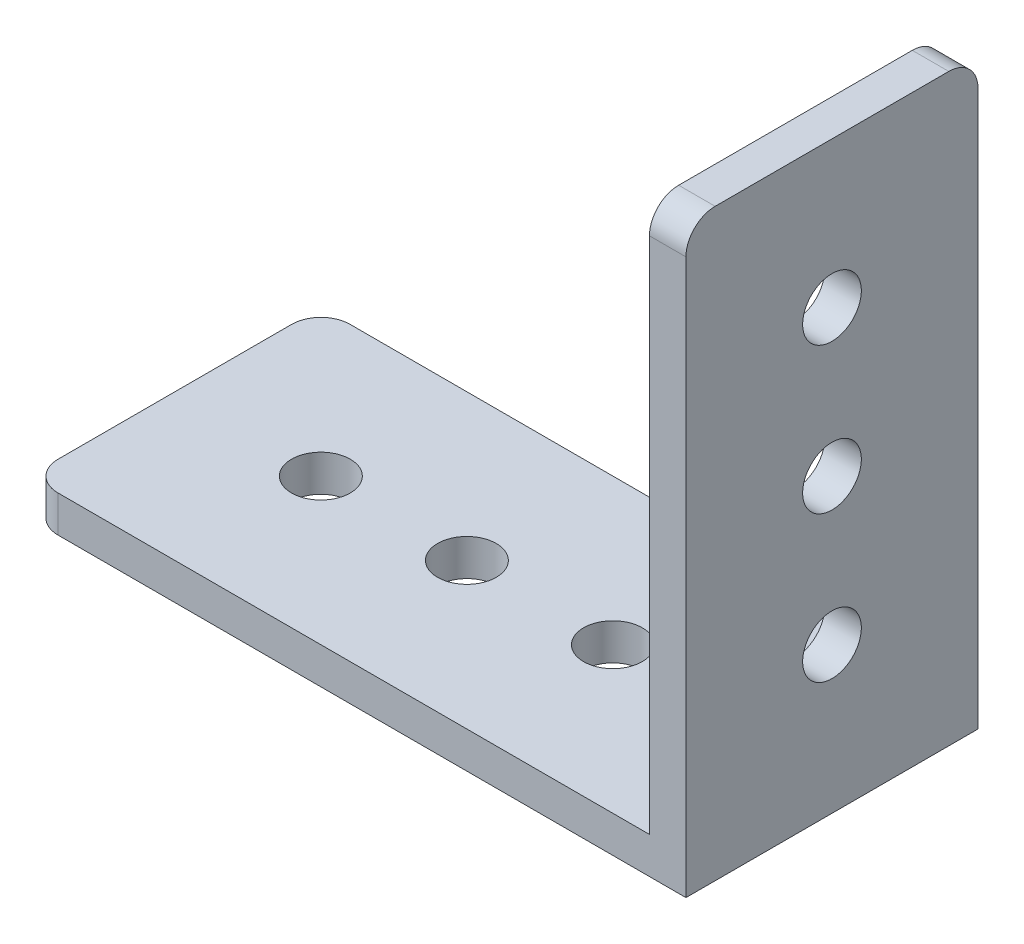
ISO-10303-21;
HEADER;
FILE_DESCRIPTION(('STEP AP214'),'2;1');
FILE_NAME('part.step','',(''),(''),'','','');
FILE_SCHEMA(('AUTOMOTIVE_DESIGN { 1 0 10303 214 1 1 1 1 }'));
ENDSEC;
DATA;
#1=APPLICATION_CONTEXT('core data for automotive mechanical design processes');
#2=APPLICATION_PROTOCOL_DEFINITION('international standard','automotive_design',2000,#1);
#3=PRODUCT_CONTEXT('',#1,'mechanical');
#4=PRODUCT('Part','Part','',(#3));
#5=PRODUCT_RELATED_PRODUCT_CATEGORY('part','',(#4));
#6=PRODUCT_DEFINITION_FORMATION('','',#4);
#7=PRODUCT_DEFINITION_CONTEXT('part definition',#1,'design');
#8=PRODUCT_DEFINITION('design','',#6,#7);
#9=PRODUCT_DEFINITION_SHAPE('','',#8);
#10=(LENGTH_UNIT() NAMED_UNIT(*) SI_UNIT(.MILLI.,.METRE.));
#11=(NAMED_UNIT(*) PLANE_ANGLE_UNIT() SI_UNIT($,.RADIAN.));
#12=(NAMED_UNIT(*) SI_UNIT($,.STERADIAN.) SOLID_ANGLE_UNIT());
#13=UNCERTAINTY_MEASURE_WITH_UNIT(LENGTH_MEASURE(1.E-05),#10,'distance_accuracy_value','');
#14=(GEOMETRIC_REPRESENTATION_CONTEXT(3) GLOBAL_UNCERTAINTY_ASSIGNED_CONTEXT((#13)) GLOBAL_UNIT_ASSIGNED_CONTEXT((#10,
#11,#12)) REPRESENTATION_CONTEXT('',''));
#15=CARTESIAN_POINT('',(0.,0.,0.));
#16=DIRECTION('',(0.,0.,1.));
#17=DIRECTION('',(1.,0.,0.));
#18=AXIS2_PLACEMENT_3D('',#15,#16,#17);
#19=CARTESIAN_POINT('',(-57.15,0.,25.4));
#20=DIRECTION('',(0.,1.,0.));
#21=DIRECTION('',(0.,0.,1.));
#22=AXIS2_PLACEMENT_3D('',#19,#20,#21);
#23=PLANE('',#22);
#24=CARTESIAN_POINT('',(-31.75,0.,12.7));
#25=DIRECTION('',(0.,1.,0.));
#26=DIRECTION('',(0.,0.,1.));
#27=AXIS2_PLACEMENT_3D('',#24,#25,#26);
#28=CIRCLE('',#27,2.55269999999999);
#29=CARTESIAN_POINT('',(-31.75,0.,15.2527));
#30=VERTEX_POINT('',#29);
#31=EDGE_CURVE('E284',#30,#30,#28,.F.);
#32=ORIENTED_EDGE('',*,*,#31,.F.);
#33=EDGE_LOOP('',(#32));
#34=FACE_BOUND('',#33,.T.);
#35=DIRECTION('',(0.,0.,-1.));
#36=VECTOR('',#35,1.);
#37=CARTESIAN_POINT('',(-57.15,0.,25.4));
#38=LINE('',#37,#36);
#39=CARTESIAN_POINT('',(-57.15,0.,22.86));
#40=VERTEX_POINT('',#39);
#41=CARTESIAN_POINT('',(-57.15,0.,2.54));
#42=VERTEX_POINT('',#41);
#43=EDGE_CURVE('E192',#40,#42,#38,.T.);
#44=ORIENTED_EDGE('',*,*,#43,.T.);
#45=CARTESIAN_POINT('',(-54.61,0.,2.54));
#46=DIRECTION('',(0.,1.,0.));
#47=DIRECTION('',(0.,0.,1.));
#48=AXIS2_PLACEMENT_3D('',#45,#46,#47);
#49=CIRCLE('',#48,2.54);
#50=CARTESIAN_POINT('',(-54.61,0.,0.));
#51=VERTEX_POINT('',#50);
#52=EDGE_CURVE('E148',#42,#51,#49,.F.);
#53=ORIENTED_EDGE('',*,*,#52,.T.);
#54=DIRECTION('',(1.,0.,0.));
#55=VECTOR('',#54,1.);
#56=CARTESIAN_POINT('',(-57.15,0.,0.));
#57=LINE('',#56,#55);
#58=CARTESIAN_POINT('',(0.,0.,0.));
#59=VERTEX_POINT('',#58);
#60=EDGE_CURVE('E133',#51,#59,#57,.T.);
#61=ORIENTED_EDGE('',*,*,#60,.T.);
#62=DIRECTION('',(0.,0.,-1.));
#63=VECTOR('',#62,1.);
#64=CARTESIAN_POINT('',(0.,0.,25.4));
#65=LINE('',#64,#63);
#66=CARTESIAN_POINT('',(0.,0.,25.4));
#67=VERTEX_POINT('',#66);
#68=EDGE_CURVE('E126',#67,#59,#65,.T.);
#69=ORIENTED_EDGE('',*,*,#68,.F.);
#70=DIRECTION('',(1.,0.,0.));
#71=VECTOR('',#70,1.);
#72=CARTESIAN_POINT('',(-57.15,0.,25.4));
#73=LINE('',#72,#71);
#74=CARTESIAN_POINT('',(-54.61,0.,25.4));
#75=VERTEX_POINT('',#74);
#76=EDGE_CURVE('E111',#75,#67,#73,.T.);
#77=ORIENTED_EDGE('',*,*,#76,.F.);
#78=CARTESIAN_POINT('',(-54.61,0.,22.86));
#79=DIRECTION('',(0.,1.,0.));
#80=DIRECTION('',(0.,0.,1.));
#81=AXIS2_PLACEMENT_3D('',#78,#79,#80);
#82=CIRCLE('',#81,2.54);
#83=EDGE_CURVE('E146',#75,#40,#82,.F.);
#84=ORIENTED_EDGE('',*,*,#83,.T.);
#85=EDGE_LOOP('',(#44,#53,#61,#69,#77,#84));
#86=FACE_BOUND('',#85,.T.);
#87=CARTESIAN_POINT('',(-44.45,0.,12.7));
#88=DIRECTION('',(0.,1.,0.));
#89=DIRECTION('',(0.,0.,1.));
#90=AXIS2_PLACEMENT_3D('',#87,#88,#89);
#91=CIRCLE('',#90,2.55269999999999);
#92=CARTESIAN_POINT('',(-44.45,0.,15.2527));
#93=VERTEX_POINT('',#92);
#94=EDGE_CURVE('E290',#93,#93,#91,.F.);
#95=ORIENTED_EDGE('',*,*,#94,.F.);
#96=EDGE_LOOP('',(#95));
#97=FACE_BOUND('',#96,.T.);
#98=CARTESIAN_POINT('',(-19.05,0.,12.7));
#99=DIRECTION('',(0.,1.,0.));
#100=DIRECTION('',(0.,0.,1.));
#101=AXIS2_PLACEMENT_3D('',#98,#99,#100);
#102=CIRCLE('',#101,2.55269999999999);
#103=CARTESIAN_POINT('',(-19.05,0.,15.2527));
#104=VERTEX_POINT('',#103);
#105=EDGE_CURVE('E276',#104,#104,#102,.F.);
#106=ORIENTED_EDGE('',*,*,#105,.F.);
#107=EDGE_LOOP('',(#106));
#108=FACE_BOUND('',#107,.T.);
#109=ADVANCED_FACE('F33',(#34,#86,#97,#108),#23,.F.);
#110=CARTESIAN_POINT('',(0.,0.,25.4));
#111=DIRECTION('',(-1.,0.,0.));
#112=DIRECTION('',(0.,0.,1.));
#113=AXIS2_PLACEMENT_3D('',#110,#111,#112);
#114=PLANE('',#113);
#115=CARTESIAN_POINT('',(0.,38.1,12.7));
#116=DIRECTION('',(-1.,0.,0.));
#117=DIRECTION('',(0.,0.,1.));
#118=AXIS2_PLACEMENT_3D('',#115,#116,#117);
#119=CIRCLE('',#118,2.55269999999999);
#120=CARTESIAN_POINT('',(0.,38.1,15.2527));
#121=VERTEX_POINT('',#120);
#122=EDGE_CURVE('E296',#121,#121,#119,.F.);
#123=ORIENTED_EDGE('',*,*,#122,.F.);
#124=EDGE_LOOP('',(#123));
#125=FACE_BOUND('',#124,.T.);
#126=CARTESIAN_POINT('',(0.,25.4,12.7));
#127=DIRECTION('',(-1.,0.,0.));
#128=DIRECTION('',(0.,0.,1.));
#129=AXIS2_PLACEMENT_3D('',#126,#127,#128);
#130=CIRCLE('',#129,2.55269999999999);
#131=CARTESIAN_POINT('',(0.,25.4,15.2527));
#132=VERTEX_POINT('',#131);
#133=EDGE_CURVE('E302',#132,#132,#130,.F.);
#134=ORIENTED_EDGE('',*,*,#133,.F.);
#135=EDGE_LOOP('',(#134));
#136=FACE_BOUND('',#135,.T.);
#137=CARTESIAN_POINT('',(0.,12.7,12.7));
#138=DIRECTION('',(-1.,0.,0.));
#139=DIRECTION('',(0.,0.,1.));
#140=AXIS2_PLACEMENT_3D('',#137,#138,#139);
#141=CIRCLE('',#140,2.55269999999999);
#142=CARTESIAN_POINT('',(0.,12.7,15.2527));
#143=VERTEX_POINT('',#142);
#144=EDGE_CURVE('E196',#143,#143,#141,.F.);
#145=ORIENTED_EDGE('',*,*,#144,.F.);
#146=EDGE_LOOP('',(#145));
#147=FACE_BOUND('',#146,.T.);
#148=DIRECTION('',(0.,1.,0.));
#149=VECTOR('',#148,1.);
#150=CARTESIAN_POINT('',(0.,0.,0.));
#151=LINE('',#150,#149);
#152=CARTESIAN_POINT('',(0.,48.26,0.));
#153=VERTEX_POINT('',#152);
#154=EDGE_CURVE('E182',#59,#153,#151,.T.);
#155=ORIENTED_EDGE('',*,*,#154,.T.);
#156=CARTESIAN_POINT('',(0.,48.26,2.54));
#157=DIRECTION('',(-1.,0.,0.));
#158=DIRECTION('',(0.,0.,1.));
#159=AXIS2_PLACEMENT_3D('',#156,#157,#158);
#160=CIRCLE('',#159,2.54);
#161=CARTESIAN_POINT('',(0.,50.8,2.54));
#162=VERTEX_POINT('',#161);
#163=EDGE_CURVE('E11',#153,#162,#160,.F.);
#164=ORIENTED_EDGE('',*,*,#163,.T.);
#165=DIRECTION('',(0.,0.,-1.));
#166=VECTOR('',#165,1.);
#167=CARTESIAN_POINT('',(0.,50.8,25.4));
#168=LINE('',#167,#166);
#169=CARTESIAN_POINT('',(0.,50.8,22.86));
#170=VERTEX_POINT('',#169);
#171=EDGE_CURVE('E136',#170,#162,#168,.T.);
#172=ORIENTED_EDGE('',*,*,#171,.F.);
#173=CARTESIAN_POINT('',(0.,48.26,22.86));
#174=DIRECTION('',(-1.,0.,0.));
#175=DIRECTION('',(0.,0.,1.));
#176=AXIS2_PLACEMENT_3D('',#173,#174,#175);
#177=CIRCLE('',#176,2.54);
#178=CARTESIAN_POINT('',(0.,48.26,25.4));
#179=VERTEX_POINT('',#178);
#180=EDGE_CURVE('E41',#170,#179,#177,.F.);
#181=ORIENTED_EDGE('',*,*,#180,.T.);
#182=DIRECTION('',(0.,1.,0.));
#183=VECTOR('',#182,1.);
#184=CARTESIAN_POINT('',(0.,0.,25.4));
#185=LINE('',#184,#183);
#186=EDGE_CURVE('E116',#67,#179,#185,.T.);
#187=ORIENTED_EDGE('',*,*,#186,.F.);
#188=ORIENTED_EDGE('',*,*,#68,.T.);
#189=EDGE_LOOP('',(#155,#164,#172,#181,#187,#188));
#190=FACE_BOUND('',#189,.T.);
#191=ADVANCED_FACE('F125',(#125,#136,#147,#190),#114,.F.);
#192=CARTESIAN_POINT('',(0.,50.8,25.4));
#193=DIRECTION('',(0.,-1.,0.));
#194=DIRECTION('',(0.,0.,-1.));
#195=AXIS2_PLACEMENT_3D('',#192,#193,#194);
#196=PLANE('',#195);
#197=ORIENTED_EDGE('',*,*,#171,.T.);
#198=DIRECTION('',(-1.,0.,0.));
#199=VECTOR('',#198,1.);
#200=CARTESIAN_POINT('',(0.,50.8,2.54));
#201=LINE('',#200,#199);
#202=CARTESIAN_POINT('',(-3.175,50.8,2.54));
#203=VERTEX_POINT('',#202);
#204=EDGE_CURVE('E162',#162,#203,#201,.T.);
#205=ORIENTED_EDGE('',*,*,#204,.T.);
#206=DIRECTION('',(0.,0.,-1.));
#207=VECTOR('',#206,1.);
#208=CARTESIAN_POINT('',(-3.175,50.8,25.4));
#209=LINE('',#208,#207);
#210=CARTESIAN_POINT('',(-3.175,50.8,22.86));
#211=VERTEX_POINT('',#210);
#212=EDGE_CURVE('E140',#211,#203,#209,.T.);
#213=ORIENTED_EDGE('',*,*,#212,.F.);
#214=DIRECTION('',(-1.,0.,0.));
#215=VECTOR('',#214,1.);
#216=CARTESIAN_POINT('',(0.,50.8,22.86));
#217=LINE('',#216,#215);
#218=EDGE_CURVE('E53',#211,#170,#217,.F.);
#219=ORIENTED_EDGE('',*,*,#218,.T.);
#220=EDGE_LOOP('',(#197,#205,#213,#219));
#221=FACE_BOUND('',#220,.T.);
#222=ADVANCED_FACE('F185',(#221),#196,.F.);
#223=CARTESIAN_POINT('',(-3.175,50.8,25.4));
#224=DIRECTION('',(1.,0.,0.));
#225=DIRECTION('',(0.,1.,0.));
#226=AXIS2_PLACEMENT_3D('',#223,#224,#225);
#227=PLANE('',#226);
#228=CARTESIAN_POINT('',(-3.175,38.1,12.7));
#229=DIRECTION('',(-1.,0.,0.));
#230=DIRECTION('',(0.,0.,1.));
#231=AXIS2_PLACEMENT_3D('',#228,#229,#230);
#232=CIRCLE('',#231,2.55269999999999);
#233=CARTESIAN_POINT('',(-3.175,38.1,15.2527));
#234=VERTEX_POINT('',#233);
#235=EDGE_CURVE('E293',#234,#234,#232,.T.);
#236=ORIENTED_EDGE('',*,*,#235,.F.);
#237=EDGE_LOOP('',(#236));
#238=FACE_BOUND('',#237,.T.);
#239=CARTESIAN_POINT('',(-3.175,25.4,12.7));
#240=DIRECTION('',(-1.,0.,0.));
#241=DIRECTION('',(0.,0.,1.));
#242=AXIS2_PLACEMENT_3D('',#239,#240,#241);
#243=CIRCLE('',#242,2.55269999999999);
#244=CARTESIAN_POINT('',(-3.175,25.4,15.2527));
#245=VERTEX_POINT('',#244);
#246=EDGE_CURVE('E299',#245,#245,#243,.T.);
#247=ORIENTED_EDGE('',*,*,#246,.F.);
#248=EDGE_LOOP('',(#247));
#249=FACE_BOUND('',#248,.T.);
#250=CARTESIAN_POINT('',(-3.175,12.7,12.7));
#251=DIRECTION('',(-1.,0.,0.));
#252=DIRECTION('',(0.,0.,1.));
#253=AXIS2_PLACEMENT_3D('',#250,#251,#252);
#254=CIRCLE('',#253,2.55269999999999);
#255=CARTESIAN_POINT('',(-3.175,12.7,15.2527));
#256=VERTEX_POINT('',#255);
#257=EDGE_CURVE('E305',#256,#256,#254,.T.);
#258=ORIENTED_EDGE('',*,*,#257,.F.);
#259=EDGE_LOOP('',(#258));
#260=FACE_BOUND('',#259,.T.);
#261=ORIENTED_EDGE('',*,*,#212,.T.);
#262=CARTESIAN_POINT('',(-3.175,48.26,2.54));
#263=DIRECTION('',(1.,0.,0.));
#264=DIRECTION('',(0.,1.,0.));
#265=AXIS2_PLACEMENT_3D('',#262,#263,#264);
#266=CIRCLE('',#265,2.54);
#267=CARTESIAN_POINT('',(-3.175,48.26,0.));
#268=VERTEX_POINT('',#267);
#269=EDGE_CURVE('E167',#203,#268,#266,.F.);
#270=ORIENTED_EDGE('',*,*,#269,.T.);
#271=DIRECTION('',(0.,-1.,0.));
#272=VECTOR('',#271,1.);
#273=CARTESIAN_POINT('',(-3.175,50.8,0.));
#274=LINE('',#273,#272);
#275=CARTESIAN_POINT('',(-3.17499999999999,3.17500000000001,0.));
#276=VERTEX_POINT('',#275);
#277=EDGE_CURVE('E173',#268,#276,#274,.T.);
#278=ORIENTED_EDGE('',*,*,#277,.T.);
#279=DIRECTION('',(0.,0.,-1.));
#280=VECTOR('',#279,1.);
#281=CARTESIAN_POINT('',(-3.17499999999999,3.17500000000001,25.4));
#282=LINE('',#281,#280);
#283=CARTESIAN_POINT('',(-3.17499999999999,3.17500000000001,25.4));
#284=VERTEX_POINT('',#283);
#285=EDGE_CURVE('E188',#284,#276,#282,.T.);
#286=ORIENTED_EDGE('',*,*,#285,.F.);
#287=DIRECTION('',(0.,-1.,0.));
#288=VECTOR('',#287,1.);
#289=CARTESIAN_POINT('',(-3.175,50.8,25.4));
#290=LINE('',#289,#288);
#291=CARTESIAN_POINT('',(-3.175,48.26,25.4));
#292=VERTEX_POINT('',#291);
#293=EDGE_CURVE('E128',#292,#284,#290,.T.);
#294=ORIENTED_EDGE('',*,*,#293,.F.);
#295=CARTESIAN_POINT('',(-3.175,48.26,22.86));
#296=DIRECTION('',(1.,0.,0.));
#297=DIRECTION('',(0.,1.,0.));
#298=AXIS2_PLACEMENT_3D('',#295,#296,#297);
#299=CIRCLE('',#298,2.54);
#300=EDGE_CURVE('E165',#292,#211,#299,.F.);
#301=ORIENTED_EDGE('',*,*,#300,.T.);
#302=EDGE_LOOP('',(#261,#270,#278,#286,#294,#301));
#303=FACE_BOUND('',#302,.T.);
#304=ADVANCED_FACE('F171',(#238,#249,#260,#303),#227,.F.);
#305=CARTESIAN_POINT('',(-3.17499999999999,3.17500000000001,25.4));
#306=DIRECTION('',(0.,-1.,0.));
#307=DIRECTION('',(1.,0.,0.));
#308=AXIS2_PLACEMENT_3D('',#305,#306,#307);
#309=PLANE('',#308);
#310=CARTESIAN_POINT('',(-19.05,3.17500000000001,12.7));
#311=DIRECTION('',(0.,1.,0.));
#312=DIRECTION('',(0.,0.,1.));
#313=AXIS2_PLACEMENT_3D('',#310,#311,#312);
#314=CIRCLE('',#313,2.55269999999999);
#315=CARTESIAN_POINT('',(-19.05,3.17500000000001,15.2527));
#316=VERTEX_POINT('',#315);
#317=EDGE_CURVE('E279',#316,#316,#314,.T.);
#318=ORIENTED_EDGE('',*,*,#317,.F.);
#319=EDGE_LOOP('',(#318));
#320=FACE_BOUND('',#319,.T.);
#321=CARTESIAN_POINT('',(-31.75,3.175,12.7));
#322=DIRECTION('',(0.,1.,0.));
#323=DIRECTION('',(0.,0.,1.));
#324=AXIS2_PLACEMENT_3D('',#321,#322,#323);
#325=CIRCLE('',#324,2.55269999999999);
#326=CARTESIAN_POINT('',(-31.75,3.175,15.2527));
#327=VERTEX_POINT('',#326);
#328=EDGE_CURVE('E281',#327,#327,#325,.T.);
#329=ORIENTED_EDGE('',*,*,#328,.F.);
#330=EDGE_LOOP('',(#329));
#331=FACE_BOUND('',#330,.T.);
#332=CARTESIAN_POINT('',(-44.45,3.175,12.7));
#333=DIRECTION('',(0.,1.,0.));
#334=DIRECTION('',(0.,0.,1.));
#335=AXIS2_PLACEMENT_3D('',#332,#333,#334);
#336=CIRCLE('',#335,2.55269999999999);
#337=CARTESIAN_POINT('',(-44.45,3.175,15.2527));
#338=VERTEX_POINT('',#337);
#339=EDGE_CURVE('E287',#338,#338,#336,.T.);
#340=ORIENTED_EDGE('',*,*,#339,.F.);
#341=EDGE_LOOP('',(#340));
#342=FACE_BOUND('',#341,.T.);
#343=DIRECTION('',(-1.,0.,0.));
#344=VECTOR('',#343,1.);
#345=CARTESIAN_POINT('',(-3.17499999999999,3.17500000000001,0.));
#346=LINE('',#345,#344);
#347=CARTESIAN_POINT('',(-54.61,3.175,0.));
#348=VERTEX_POINT('',#347);
#349=EDGE_CURVE('E122',#276,#348,#346,.T.);
#350=ORIENTED_EDGE('',*,*,#349,.T.);
#351=CARTESIAN_POINT('',(-54.61,3.175,2.54));
#352=DIRECTION('',(0.,-1.,0.));
#353=DIRECTION('',(1.,0.,0.));
#354=AXIS2_PLACEMENT_3D('',#351,#352,#353);
#355=CIRCLE('',#354,2.54);
#356=CARTESIAN_POINT('',(-57.15,3.175,2.54));
#357=VERTEX_POINT('',#356);
#358=EDGE_CURVE('E156',#348,#357,#355,.F.);
#359=ORIENTED_EDGE('',*,*,#358,.T.);
#360=DIRECTION('',(0.,0.,-1.));
#361=VECTOR('',#360,1.);
#362=CARTESIAN_POINT('',(-57.15,3.175,25.4));
#363=LINE('',#362,#361);
#364=CARTESIAN_POINT('',(-57.15,3.175,22.86));
#365=VERTEX_POINT('',#364);
#366=EDGE_CURVE('E200',#365,#357,#363,.T.);
#367=ORIENTED_EDGE('',*,*,#366,.F.);
#368=CARTESIAN_POINT('',(-54.61,3.175,22.86));
#369=DIRECTION('',(0.,-1.,0.));
#370=DIRECTION('',(1.,0.,0.));
#371=AXIS2_PLACEMENT_3D('',#368,#369,#370);
#372=CIRCLE('',#371,2.54);
#373=CARTESIAN_POINT('',(-54.61,3.175,25.4));
#374=VERTEX_POINT('',#373);
#375=EDGE_CURVE('E154',#365,#374,#372,.F.);
#376=ORIENTED_EDGE('',*,*,#375,.T.);
#377=DIRECTION('',(-1.,0.,0.));
#378=VECTOR('',#377,1.);
#379=CARTESIAN_POINT('',(-3.17499999999999,3.17500000000001,25.4));
#380=LINE('',#379,#378);
#381=EDGE_CURVE('E190',#284,#374,#380,.T.);
#382=ORIENTED_EDGE('',*,*,#381,.F.);
#383=ORIENTED_EDGE('',*,*,#285,.T.);
#384=EDGE_LOOP('',(#350,#359,#367,#376,#382,#383));
#385=FACE_BOUND('',#384,.T.);
#386=ADVANCED_FACE('F204',(#320,#331,#342,#385),#309,.F.);
#387=CARTESIAN_POINT('',(-57.15,3.175,25.4));
#388=DIRECTION('',(1.,0.,0.));
#389=DIRECTION('',(0.,0.,-1.));
#390=AXIS2_PLACEMENT_3D('',#387,#388,#389);
#391=PLANE('',#390);
#392=ORIENTED_EDGE('',*,*,#366,.T.);
#393=DIRECTION('',(0.,-1.,0.));
#394=VECTOR('',#393,1.);
#395=CARTESIAN_POINT('',(-57.15,3.175,2.54));
#396=LINE('',#395,#394);
#397=EDGE_CURVE('E138',#357,#42,#396,.T.);
#398=ORIENTED_EDGE('',*,*,#397,.T.);
#399=ORIENTED_EDGE('',*,*,#43,.F.);
#400=DIRECTION('',(0.,-1.,0.));
#401=VECTOR('',#400,1.);
#402=CARTESIAN_POINT('',(-57.15,3.175,22.86));
#403=LINE('',#402,#401);
#404=EDGE_CURVE('E135',#40,#365,#403,.F.);
#405=ORIENTED_EDGE('',*,*,#404,.T.);
#406=EDGE_LOOP('',(#392,#398,#399,#405));
#407=FACE_BOUND('',#406,.T.);
#408=ADVANCED_FACE('F213',(#407),#391,.F.);
#409=CARTESIAN_POINT('',(0.,0.,25.4));
#410=DIRECTION('',(0.,0.,1.));
#411=DIRECTION('',(1.,0.,0.));
#412=AXIS2_PLACEMENT_3D('',#409,#410,#411);
#413=PLANE('',#412);
#414=ORIENTED_EDGE('',*,*,#381,.T.);
#415=DIRECTION('',(0.,-1.,0.));
#416=VECTOR('',#415,1.);
#417=CARTESIAN_POINT('',(-54.61,0.,25.4));
#418=LINE('',#417,#416);
#419=EDGE_CURVE('E119',#374,#75,#418,.T.);
#420=ORIENTED_EDGE('',*,*,#419,.T.);
#421=ORIENTED_EDGE('',*,*,#76,.T.);
#422=ORIENTED_EDGE('',*,*,#186,.T.);
#423=DIRECTION('',(-1.,0.,0.));
#424=VECTOR('',#423,1.);
#425=CARTESIAN_POINT('',(-3.175,48.26,25.4));
#426=LINE('',#425,#424);
#427=EDGE_CURVE('E158',#179,#292,#426,.T.);
#428=ORIENTED_EDGE('',*,*,#427,.T.);
#429=ORIENTED_EDGE('',*,*,#293,.T.);
#430=EDGE_LOOP('',(#414,#420,#421,#422,#428,#429));
#431=FACE_BOUND('',#430,.T.);
#432=ADVANCED_FACE('F114',(#431),#413,.T.);
#433=CARTESIAN_POINT('',(0.,0.,0.));
#434=DIRECTION('',(0.,0.,1.));
#435=DIRECTION('',(1.,0.,0.));
#436=AXIS2_PLACEMENT_3D('',#433,#434,#435);
#437=PLANE('',#436);
#438=ORIENTED_EDGE('',*,*,#60,.F.);
#439=DIRECTION('',(0.,-1.,0.));
#440=VECTOR('',#439,1.);
#441=CARTESIAN_POINT('',(-54.61,0.,0.));
#442=LINE('',#441,#440);
#443=EDGE_CURVE('E152',#51,#348,#442,.F.);
#444=ORIENTED_EDGE('',*,*,#443,.T.);
#445=ORIENTED_EDGE('',*,*,#349,.F.);
#446=ORIENTED_EDGE('',*,*,#277,.F.);
#447=DIRECTION('',(-1.,0.,0.));
#448=VECTOR('',#447,1.);
#449=CARTESIAN_POINT('',(0.,48.26,0.));
#450=LINE('',#449,#448);
#451=EDGE_CURVE('E150',#268,#153,#450,.F.);
#452=ORIENTED_EDGE('',*,*,#451,.T.);
#453=ORIENTED_EDGE('',*,*,#154,.F.);
#454=EDGE_LOOP('',(#438,#444,#445,#446,#452,#453));
#455=FACE_BOUND('',#454,.T.);
#456=ADVANCED_FACE('F180',(#455),#437,.F.);
#457=CARTESIAN_POINT('',(-54.61,3.175,2.54));
#458=DIRECTION('',(0.,-1.,0.));
#459=DIRECTION('',(0.,0.,-1.));
#460=AXIS2_PLACEMENT_3D('',#457,#458,#459);
#461=CYLINDRICAL_SURFACE('',#460,2.54);
#462=ORIENTED_EDGE('',*,*,#358,.F.);
#463=ORIENTED_EDGE('',*,*,#443,.F.);
#464=ORIENTED_EDGE('',*,*,#52,.F.);
#465=ORIENTED_EDGE('',*,*,#397,.F.);
#466=EDGE_LOOP('',(#462,#463,#464,#465));
#467=FACE_BOUND('',#466,.T.);
#468=ADVANCED_FACE('F216',(#467),#461,.T.);
#469=CARTESIAN_POINT('',(-54.61,0.,22.86));
#470=DIRECTION('',(0.,1.,0.));
#471=DIRECTION('',(0.,0.,1.));
#472=AXIS2_PLACEMENT_3D('',#469,#470,#471);
#473=CYLINDRICAL_SURFACE('',#472,2.54);
#474=ORIENTED_EDGE('',*,*,#375,.F.);
#475=ORIENTED_EDGE('',*,*,#404,.F.);
#476=ORIENTED_EDGE('',*,*,#83,.F.);
#477=ORIENTED_EDGE('',*,*,#419,.F.);
#478=EDGE_LOOP('',(#474,#475,#476,#477));
#479=FACE_BOUND('',#478,.T.);
#480=ADVANCED_FACE('F209',(#479),#473,.T.);
#481=CARTESIAN_POINT('',(0.,48.26,2.54));
#482=DIRECTION('',(-1.,0.,0.));
#483=DIRECTION('',(0.,0.,1.));
#484=AXIS2_PLACEMENT_3D('',#481,#482,#483);
#485=CYLINDRICAL_SURFACE('',#484,2.54);
#486=ORIENTED_EDGE('',*,*,#163,.F.);
#487=ORIENTED_EDGE('',*,*,#451,.F.);
#488=ORIENTED_EDGE('',*,*,#269,.F.);
#489=ORIENTED_EDGE('',*,*,#204,.F.);
#490=EDGE_LOOP('',(#486,#487,#488,#489));
#491=FACE_BOUND('',#490,.T.);
#492=ADVANCED_FACE('F184',(#491),#485,.T.);
#493=CARTESIAN_POINT('',(0.,48.26,22.86));
#494=DIRECTION('',(1.,0.,0.));
#495=DIRECTION('',(0.,0.,-1.));
#496=AXIS2_PLACEMENT_3D('',#493,#494,#495);
#497=CYLINDRICAL_SURFACE('',#496,2.54);
#498=ORIENTED_EDGE('',*,*,#180,.F.);
#499=ORIENTED_EDGE('',*,*,#218,.F.);
#500=ORIENTED_EDGE('',*,*,#300,.F.);
#501=ORIENTED_EDGE('',*,*,#427,.F.);
#502=EDGE_LOOP('',(#498,#499,#500,#501));
#503=FACE_BOUND('',#502,.T.);
#504=ADVANCED_FACE('F35',(#503),#497,.T.);
#505=CARTESIAN_POINT('',(-3.17499999999999,12.7,12.7));
#506=DIRECTION('',(-1.,0.,0.));
#507=DIRECTION('',(0.,0.,1.));
#508=AXIS2_PLACEMENT_3D('',#505,#506,#507);
#509=CYLINDRICAL_SURFACE('',#508,2.55269999999999);
#510=ORIENTED_EDGE('',*,*,#144,.T.);
#511=EDGE_LOOP('',(#510));
#512=FACE_BOUND('',#511,.T.);
#513=ORIENTED_EDGE('',*,*,#257,.T.);
#514=EDGE_LOOP('',(#513));
#515=FACE_BOUND('',#514,.T.);
#516=ADVANCED_FACE('F248',(#512,#515),#509,.F.);
#517=CARTESIAN_POINT('',(-3.175,25.4,12.7));
#518=DIRECTION('',(-1.,0.,0.));
#519=DIRECTION('',(0.,0.,1.));
#520=AXIS2_PLACEMENT_3D('',#517,#518,#519);
#521=CYLINDRICAL_SURFACE('',#520,2.55269999999999);
#522=ORIENTED_EDGE('',*,*,#133,.T.);
#523=EDGE_LOOP('',(#522));
#524=FACE_BOUND('',#523,.T.);
#525=ORIENTED_EDGE('',*,*,#246,.T.);
#526=EDGE_LOOP('',(#525));
#527=FACE_BOUND('',#526,.T.);
#528=ADVANCED_FACE('F251',(#524,#527),#521,.F.);
#529=CARTESIAN_POINT('',(-3.175,38.1,12.7));
#530=DIRECTION('',(-1.,0.,0.));
#531=DIRECTION('',(0.,0.,1.));
#532=AXIS2_PLACEMENT_3D('',#529,#530,#531);
#533=CYLINDRICAL_SURFACE('',#532,2.55269999999999);
#534=ORIENTED_EDGE('',*,*,#122,.T.);
#535=EDGE_LOOP('',(#534));
#536=FACE_BOUND('',#535,.T.);
#537=ORIENTED_EDGE('',*,*,#235,.T.);
#538=EDGE_LOOP('',(#537));
#539=FACE_BOUND('',#538,.T.);
#540=ADVANCED_FACE('F255',(#536,#539),#533,.F.);
#541=CARTESIAN_POINT('',(-44.45,3.175,12.7));
#542=DIRECTION('',(0.,1.,0.));
#543=DIRECTION('',(0.,0.,1.));
#544=AXIS2_PLACEMENT_3D('',#541,#542,#543);
#545=CYLINDRICAL_SURFACE('',#544,2.55269999999999);
#546=ORIENTED_EDGE('',*,*,#94,.T.);
#547=EDGE_LOOP('',(#546));
#548=FACE_BOUND('',#547,.T.);
#549=ORIENTED_EDGE('',*,*,#339,.T.);
#550=EDGE_LOOP('',(#549));
#551=FACE_BOUND('',#550,.T.);
#552=ADVANCED_FACE('F259',(#548,#551),#545,.F.);
#553=CARTESIAN_POINT('',(-31.75,3.175,12.7));
#554=DIRECTION('',(0.,1.,0.));
#555=DIRECTION('',(0.,0.,1.));
#556=AXIS2_PLACEMENT_3D('',#553,#554,#555);
#557=CYLINDRICAL_SURFACE('',#556,2.55269999999999);
#558=ORIENTED_EDGE('',*,*,#31,.T.);
#559=EDGE_LOOP('',(#558));
#560=FACE_BOUND('',#559,.T.);
#561=ORIENTED_EDGE('',*,*,#328,.T.);
#562=EDGE_LOOP('',(#561));
#563=FACE_BOUND('',#562,.T.);
#564=ADVANCED_FACE('F263',(#560,#563),#557,.F.);
#565=CARTESIAN_POINT('',(-19.05,3.175,12.7));
#566=DIRECTION('',(0.,1.,0.));
#567=DIRECTION('',(0.,0.,1.));
#568=AXIS2_PLACEMENT_3D('',#565,#566,#567);
#569=CYLINDRICAL_SURFACE('',#568,2.55269999999999);
#570=ORIENTED_EDGE('',*,*,#105,.T.);
#571=EDGE_LOOP('',(#570));
#572=FACE_BOUND('',#571,.T.);
#573=ORIENTED_EDGE('',*,*,#317,.T.);
#574=EDGE_LOOP('',(#573));
#575=FACE_BOUND('',#574,.T.);
#576=ADVANCED_FACE('F267',(#572,#575),#569,.F.);
#577=CLOSED_SHELL('',(#109,#191,#222,#304,#386,#408,#432,#456,#468,#480,#492,#504,#516,#528,
#540,#552,#564,#576));
#578=MANIFOLD_SOLID_BREP('B2',#577);
#579=ADVANCED_BREP_SHAPE_REPRESENTATION('',(#18,#578),#14);
#580=SHAPE_DEFINITION_REPRESENTATION(#9,#579);
ENDSEC;
END-ISO-10303-21;
